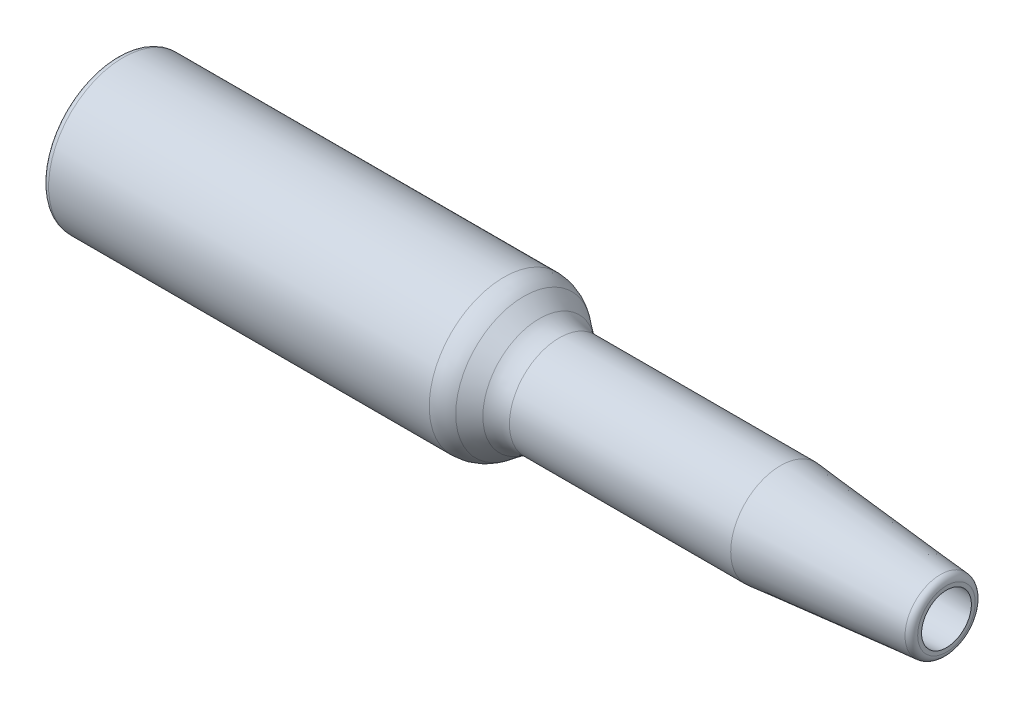
ISO-10303-21;
HEADER;
FILE_DESCRIPTION(('STEP AP214'),'2;1');
FILE_NAME('part.step','',(''),(''),'','','');
FILE_SCHEMA(('AUTOMOTIVE_DESIGN { 1 0 10303 214 1 1 1 1 }'));
ENDSEC;
DATA;
#1=APPLICATION_CONTEXT('core data for automotive mechanical design processes');
#2=APPLICATION_PROTOCOL_DEFINITION('international standard','automotive_design',2000,#1);
#3=PRODUCT_CONTEXT('',#1,'mechanical');
#4=PRODUCT('Part','Part','',(#3));
#5=PRODUCT_RELATED_PRODUCT_CATEGORY('part','',(#4));
#6=PRODUCT_DEFINITION_FORMATION('','',#4);
#7=PRODUCT_DEFINITION_CONTEXT('part definition',#1,'design');
#8=PRODUCT_DEFINITION('design','',#6,#7);
#9=PRODUCT_DEFINITION_SHAPE('','',#8);
#10=(LENGTH_UNIT() NAMED_UNIT(*) SI_UNIT(.MILLI.,.METRE.));
#11=(NAMED_UNIT(*) PLANE_ANGLE_UNIT() SI_UNIT($,.RADIAN.));
#12=(NAMED_UNIT(*) SI_UNIT($,.STERADIAN.) SOLID_ANGLE_UNIT());
#13=UNCERTAINTY_MEASURE_WITH_UNIT(LENGTH_MEASURE(1.E-05),#10,'distance_accuracy_value','');
#14=(GEOMETRIC_REPRESENTATION_CONTEXT(3) GLOBAL_UNCERTAINTY_ASSIGNED_CONTEXT((#13)) GLOBAL_UNIT_ASSIGNED_CONTEXT((#10,
#11,#12)) REPRESENTATION_CONTEXT('',''));
#15=CARTESIAN_POINT('',(0.,0.,0.));
#16=DIRECTION('',(0.,0.,1.));
#17=DIRECTION('',(1.,0.,0.));
#18=AXIS2_PLACEMENT_3D('',#15,#16,#17);
#19=CARTESIAN_POINT('',(-52.4416752843847,0.,0.));
#20=DIRECTION('',(-1.,0.,0.));
#21=DIRECTION('',(0.,0.,1.));
#22=AXIS2_PLACEMENT_3D('',#19,#20,#21);
#23=CYLINDRICAL_SURFACE('',#22,1.83499015698653);
#24=CARTESIAN_POINT('',(-10.6027177890553,0.,0.));
#25=DIRECTION('',(-1.,0.,0.));
#26=DIRECTION('',(0.,0.,1.));
#27=AXIS2_PLACEMENT_3D('',#24,#25,#26);
#28=CIRCLE('',#27,1.83499015698653);
#29=CARTESIAN_POINT('',(-10.6027177890553,0.,1.83499015698653));
#30=VERTEX_POINT('',#29);
#31=EDGE_CURVE('E60',#30,#30,#28,.T.);
#32=ORIENTED_EDGE('',*,*,#31,.F.);
#33=EDGE_LOOP('',(#32));
#34=FACE_BOUND('',#33,.T.);
#35=CARTESIAN_POINT('',(-22.3924508790072,0.,0.));
#36=DIRECTION('',(-1.,0.,0.));
#37=DIRECTION('',(0.,0.,1.));
#38=AXIS2_PLACEMENT_3D('',#35,#36,#37);
#39=CIRCLE('',#38,1.83499015698653);
#40=CARTESIAN_POINT('',(-22.3924508790072,0.,1.83499015698653));
#41=VERTEX_POINT('',#40);
#42=EDGE_CURVE('E75',#41,#41,#39,.T.);
#43=ORIENTED_EDGE('',*,*,#42,.T.);
#44=EDGE_LOOP('',(#43));
#45=FACE_BOUND('',#44,.T.);
#46=ADVANCED_FACE('F29',(#34,#45),#23,.F.);
#47=CARTESIAN_POINT('',(-10.6027177890553,0.,0.));
#48=DIRECTION('',(-1.,0.,0.));
#49=DIRECTION('',(0.,0.,1.));
#50=AXIS2_PLACEMENT_3D('',#47,#48,#49);
#51=CONICAL_SURFACE('',#50,1.83499015698653,0.5457668843435);
#52=CARTESIAN_POINT('',(-9.39245087900727,0.,0.));
#53=DIRECTION('',(-1.,0.,0.));
#54=DIRECTION('',(0.,0.,1.));
#55=AXIS2_PLACEMENT_3D('',#52,#53,#54);
#56=CIRCLE('',#55,1.09999999999994);
#57=CARTESIAN_POINT('',(-9.39245087900727,0.,1.09999999999994));
#58=VERTEX_POINT('',#57);
#59=EDGE_CURVE('E63',#58,#58,#56,.T.);
#60=ORIENTED_EDGE('',*,*,#59,.F.);
#61=EDGE_LOOP('',(#60));
#62=FACE_BOUND('',#61,.T.);
#63=ORIENTED_EDGE('',*,*,#31,.T.);
#64=EDGE_LOOP('',(#63));
#65=FACE_BOUND('',#64,.T.);
#66=ADVANCED_FACE('F96',(#62,#65),#51,.F.);
#67=CARTESIAN_POINT('',(-52.4416752843847,0.,0.));
#68=DIRECTION('',(-1.,0.,0.));
#69=DIRECTION('',(0.,0.,1.));
#70=AXIS2_PLACEMENT_3D('',#67,#68,#69);
#71=CYLINDRICAL_SURFACE('',#70,1.09999999999994);
#72=CARTESIAN_POINT('',(-2.66331204610992,0.,0.));
#73=DIRECTION('',(-1.,0.,0.));
#74=DIRECTION('',(0.,0.,1.));
#75=AXIS2_PLACEMENT_3D('',#72,#73,#74);
#76=CIRCLE('',#75,1.09999999999994);
#77=CARTESIAN_POINT('',(-2.66331204610992,0.,1.09999999999994));
#78=VERTEX_POINT('',#77);
#79=EDGE_CURVE('E66',#78,#78,#76,.T.);
#80=ORIENTED_EDGE('',*,*,#79,.F.);
#81=EDGE_LOOP('',(#80));
#82=FACE_BOUND('',#81,.T.);
#83=ORIENTED_EDGE('',*,*,#59,.T.);
#84=EDGE_LOOP('',(#83));
#85=FACE_BOUND('',#84,.T.);
#86=ADVANCED_FACE('F101',(#82,#85),#71,.F.);
#87=CARTESIAN_POINT('',(-2.66331204610992,0.,0.));
#88=DIRECTION('',(-1.,0.,0.));
#89=DIRECTION('',(0.,0.,1.));
#90=AXIS2_PLACEMENT_3D('',#87,#88,#89);
#91=CONICAL_SURFACE('',#90,1.09999999999994,0.0663054714169648);
#92=CARTESIAN_POINT('',(2.60754912099277,0.,0.));
#93=DIRECTION('',(-1.,0.,0.));
#94=DIRECTION('',(0.,0.,1.));
#95=AXIS2_PLACEMENT_3D('',#92,#93,#94);
#96=CIRCLE('',#95,0.75);
#97=CARTESIAN_POINT('',(2.60754912099277,0.,0.75));
#98=VERTEX_POINT('',#97);
#99=EDGE_CURVE('E69',#98,#98,#96,.T.);
#100=ORIENTED_EDGE('',*,*,#99,.F.);
#101=EDGE_LOOP('',(#100));
#102=FACE_BOUND('',#101,.T.);
#103=ORIENTED_EDGE('',*,*,#79,.T.);
#104=EDGE_LOOP('',(#103));
#105=FACE_BOUND('',#104,.T.);
#106=ADVANCED_FACE('F108',(#102,#105),#91,.F.);
#107=CARTESIAN_POINT('',(2.60754912099276,1.05,0.));
#108=DIRECTION('',(-1.,0.,0.));
#109=DIRECTION('',(0.,0.,1.));
#110=AXIS2_PLACEMENT_3D('',#107,#108,#109);
#111=PLANE('',#110);
#112=CARTESIAN_POINT('',(2.60754912099276,0.,0.));
#113=DIRECTION('',(-1.,0.,0.));
#114=DIRECTION('',(0.,0.,1.));
#115=AXIS2_PLACEMENT_3D('',#112,#113,#114);
#116=CIRCLE('',#115,0.867191633640428);
#117=CARTESIAN_POINT('',(2.60754912099276,0.,0.867191633640428));
#118=VERTEX_POINT('',#117);
#119=EDGE_CURVE('E54',#118,#118,#116,.F.);
#120=ORIENTED_EDGE('',*,*,#119,.T.);
#121=EDGE_LOOP('',(#120));
#122=FACE_BOUND('',#121,.T.);
#123=ORIENTED_EDGE('',*,*,#99,.T.);
#124=EDGE_LOOP('',(#123));
#125=FACE_BOUND('',#124,.T.);
#126=ADVANCED_FACE('F115',(#122,#125),#111,.F.);
#127=CARTESIAN_POINT('',(2.60754912099277,0.,0.));
#128=DIRECTION('',(-1.,0.,0.));
#129=DIRECTION('',(0.,0.,1.));
#130=AXIS2_PLACEMENT_3D('',#127,#128,#129);
#131=CONICAL_SURFACE('',#130,1.05,0.0897581741899506);
#132=CARTESIAN_POINT('',(2.42547666089194,0.,0.));
#133=DIRECTION('',(1.,0.,0.));
#134=DIRECTION('',(0.,0.,-1.));
#135=AXIS2_PLACEMENT_3D('',#132,#133,#134);
#136=CIRCLE('',#135,1.06638652140907);
#137=CARTESIAN_POINT('',(2.42547666089194,0.,-1.06638652140907));
#138=VERTEX_POINT('',#137);
#139=EDGE_CURVE('E57',#138,#138,#136,.F.);
#140=ORIENTED_EDGE('',*,*,#139,.T.);
#141=EDGE_LOOP('',(#140));
#142=FACE_BOUND('',#141,.T.);
#143=CARTESIAN_POINT('',(-2.39245087900723,0.,0.));
#144=DIRECTION('',(-1.,0.,0.));
#145=DIRECTION('',(0.,0.,1.));
#146=AXIS2_PLACEMENT_3D('',#143,#144,#145);
#147=CIRCLE('',#146,1.5);
#148=CARTESIAN_POINT('',(-2.39245087900723,0.,1.5));
#149=VERTEX_POINT('',#148);
#150=EDGE_CURVE('E72',#149,#149,#147,.T.);
#151=ORIENTED_EDGE('',*,*,#150,.F.);
#152=EDGE_LOOP('',(#151));
#153=FACE_BOUND('',#152,.T.);
#154=ADVANCED_FACE('F119',(#142,#153),#131,.T.);
#155=CARTESIAN_POINT('',(-52.4416752843847,0.,0.));
#156=DIRECTION('',(-1.,0.,0.));
#157=DIRECTION('',(0.,0.,1.));
#158=AXIS2_PLACEMENT_3D('',#155,#156,#157);
#159=CYLINDRICAL_SURFACE('',#158,1.5);
#160=CARTESIAN_POINT('',(-9.05911754567391,0.,0.));
#161=DIRECTION('',(-1.,0.,0.));
#162=DIRECTION('',(0.,0.,1.));
#163=AXIS2_PLACEMENT_3D('',#160,#161,#162);
#164=CIRCLE('',#163,1.5);
#165=CARTESIAN_POINT('',(-9.05911754567391,0.,1.5));
#166=VERTEX_POINT('',#165);
#167=EDGE_CURVE('E35',#166,#166,#164,.F.);
#168=ORIENTED_EDGE('',*,*,#167,.T.);
#169=EDGE_LOOP('',(#168));
#170=FACE_BOUND('',#169,.T.);
#171=ORIENTED_EDGE('',*,*,#150,.T.);
#172=EDGE_LOOP('',(#171));
#173=FACE_BOUND('',#172,.T.);
#174=ADVANCED_FACE('F123',(#170,#173),#159,.T.);
#175=CARTESIAN_POINT('',(-9.39245087900724,0.,0.));
#176=DIRECTION('',(-1.,0.,0.));
#177=DIRECTION('',(0.,0.,1.));
#178=AXIS2_PLACEMENT_3D('',#175,#176,#177);
#179=CONICAL_SURFACE('',#178,1.5,0.643501108793284);
#180=CARTESIAN_POINT('',(-9.65911754567391,0.,0.));
#181=DIRECTION('',(-1.,0.,0.));
#182=DIRECTION('',(0.,0.,1.));
#183=AXIS2_PLACEMENT_3D('',#180,#181,#182);
#184=CIRCLE('',#183,1.7);
#185=CARTESIAN_POINT('',(-9.65911754567391,0.,1.7));
#186=VERTEX_POINT('',#185);
#187=EDGE_CURVE('E39',#186,#186,#184,.T.);
#188=ORIENTED_EDGE('',*,*,#187,.T.);
#189=EDGE_LOOP('',(#188));
#190=FACE_BOUND('',#189,.T.);
#191=CARTESIAN_POINT('',(-10.1257842123406,0.,0.));
#192=DIRECTION('',(1.,0.,0.));
#193=DIRECTION('',(0.,0.,-1.));
#194=AXIS2_PLACEMENT_3D('',#191,#192,#193);
#195=CIRCLE('',#194,2.05);
#196=CARTESIAN_POINT('',(-10.1257842123406,0.,-2.05));
#197=VERTEX_POINT('',#196);
#198=EDGE_CURVE('E43',#197,#197,#195,.T.);
#199=ORIENTED_EDGE('',*,*,#198,.T.);
#200=EDGE_LOOP('',(#199));
#201=FACE_BOUND('',#200,.T.);
#202=ADVANCED_FACE('F93',(#190,#201),#179,.T.);
#203=CARTESIAN_POINT('',(-52.4416752843847,0.,0.));
#204=DIRECTION('',(-1.,0.,0.));
#205=DIRECTION('',(0.,0.,1.));
#206=AXIS2_PLACEMENT_3D('',#203,#204,#205);
#207=CYLINDRICAL_SURFACE('',#206,2.25);
#208=CARTESIAN_POINT('',(-10.7257842123406,0.,0.));
#209=DIRECTION('',(1.,0.,0.));
#210=DIRECTION('',(0.,0.,-1.));
#211=AXIS2_PLACEMENT_3D('',#208,#209,#210);
#212=CIRCLE('',#211,2.25);
#213=CARTESIAN_POINT('',(-10.7257842123406,0.,-2.25));
#214=VERTEX_POINT('',#213);
#215=EDGE_CURVE('E10',#214,#214,#212,.F.);
#216=ORIENTED_EDGE('',*,*,#215,.T.);
#217=EDGE_LOOP('',(#216));
#218=FACE_BOUND('',#217,.T.);
#219=CARTESIAN_POINT('',(-22.1924508790072,0.,0.));
#220=DIRECTION('',(1.,0.,0.));
#221=DIRECTION('',(0.,0.,-1.));
#222=AXIS2_PLACEMENT_3D('',#219,#220,#221);
#223=CIRCLE('',#222,2.25);
#224=CARTESIAN_POINT('',(-22.1924508790072,0.,-2.25));
#225=VERTEX_POINT('',#224);
#226=EDGE_CURVE('E48',#225,#225,#223,.T.);
#227=ORIENTED_EDGE('',*,*,#226,.T.);
#228=EDGE_LOOP('',(#227));
#229=FACE_BOUND('',#228,.T.);
#230=ADVANCED_FACE('F83',(#218,#229),#207,.T.);
#231=CARTESIAN_POINT('',(-22.3924508790072,1.83499015698653,0.));
#232=DIRECTION('',(1.,0.,0.));
#233=DIRECTION('',(0.,0.,-1.));
#234=AXIS2_PLACEMENT_3D('',#231,#232,#233);
#235=PLANE('',#234);
#236=CARTESIAN_POINT('',(-22.3924508790072,0.,0.));
#237=DIRECTION('',(1.,0.,0.));
#238=DIRECTION('',(0.,0.,-1.));
#239=AXIS2_PLACEMENT_3D('',#236,#237,#238);
#240=CIRCLE('',#239,2.05);
#241=CARTESIAN_POINT('',(-22.3924508790072,0.,-2.05));
#242=VERTEX_POINT('',#241);
#243=EDGE_CURVE('E51',#242,#242,#240,.F.);
#244=ORIENTED_EDGE('',*,*,#243,.T.);
#245=EDGE_LOOP('',(#244));
#246=FACE_BOUND('',#245,.T.);
#247=ORIENTED_EDGE('',*,*,#42,.F.);
#248=EDGE_LOOP('',(#247));
#249=FACE_BOUND('',#248,.T.);
#250=ADVANCED_FACE('F80',(#246,#249),#235,.F.);
#251=CARTESIAN_POINT('',(2.40754912099276,0.,0.));
#252=DIRECTION('',(-1.,0.,0.));
#253=DIRECTION('',(0.,0.,1.));
#254=AXIS2_PLACEMENT_3D('',#251,#252,#253);
#255=TOROIDAL_SURFACE('',#254,0.867191633640428,0.2);
#256=ORIENTED_EDGE('',*,*,#119,.F.);
#257=EDGE_LOOP('',(#256));
#258=FACE_BOUND('',#257,.T.);
#259=ORIENTED_EDGE('',*,*,#139,.F.);
#260=EDGE_LOOP('',(#259));
#261=FACE_BOUND('',#260,.T.);
#262=ADVANCED_FACE('F82',(#258,#261),#255,.T.);
#263=CARTESIAN_POINT('',(-22.1924508790072,0.,0.));
#264=DIRECTION('',(1.,0.,0.));
#265=DIRECTION('',(0.,0.,-1.));
#266=AXIS2_PLACEMENT_3D('',#263,#264,#265);
#267=TOROIDAL_SURFACE('',#266,2.05,0.2);
#268=ORIENTED_EDGE('',*,*,#226,.F.);
#269=EDGE_LOOP('',(#268));
#270=FACE_BOUND('',#269,.T.);
#271=ORIENTED_EDGE('',*,*,#243,.F.);
#272=EDGE_LOOP('',(#271));
#273=FACE_BOUND('',#272,.T.);
#274=ADVANCED_FACE('F90',(#270,#273),#267,.T.);
#275=CARTESIAN_POINT('',(-9.05911754567391,0.,0.));
#276=DIRECTION('',(-1.,0.,0.));
#277=DIRECTION('',(0.,0.,1.));
#278=AXIS2_PLACEMENT_3D('',#275,#276,#277);
#279=TOROIDAL_SURFACE('',#278,2.5,1.);
#280=ORIENTED_EDGE('',*,*,#167,.F.);
#281=EDGE_LOOP('',(#280));
#282=FACE_BOUND('',#281,.T.);
#283=ORIENTED_EDGE('',*,*,#187,.F.);
#284=EDGE_LOOP('',(#283));
#285=FACE_BOUND('',#284,.T.);
#286=ADVANCED_FACE('F138',(#282,#285),#279,.F.);
#287=CARTESIAN_POINT('',(-10.7257842123406,0.,0.));
#288=DIRECTION('',(1.,0.,0.));
#289=DIRECTION('',(0.,0.,-1.));
#290=AXIS2_PLACEMENT_3D('',#287,#288,#289);
#291=TOROIDAL_SURFACE('',#290,1.25,1.);
#292=ORIENTED_EDGE('',*,*,#198,.F.);
#293=EDGE_LOOP('',(#292));
#294=FACE_BOUND('',#293,.T.);
#295=ORIENTED_EDGE('',*,*,#215,.F.);
#296=EDGE_LOOP('',(#295));
#297=FACE_BOUND('',#296,.T.);
#298=ADVANCED_FACE('F135',(#294,#297),#291,.T.);
#299=CLOSED_SHELL('',(#46,#66,#86,#106,#126,#154,#174,#202,#230,#250,#262,#274,#286,#298));
#300=MANIFOLD_SOLID_BREP('B2',#299);
#301=ADVANCED_BREP_SHAPE_REPRESENTATION('',(#18,#300),#14);
#302=SHAPE_DEFINITION_REPRESENTATION(#9,#301);
ENDSEC;
END-ISO-10303-21;
